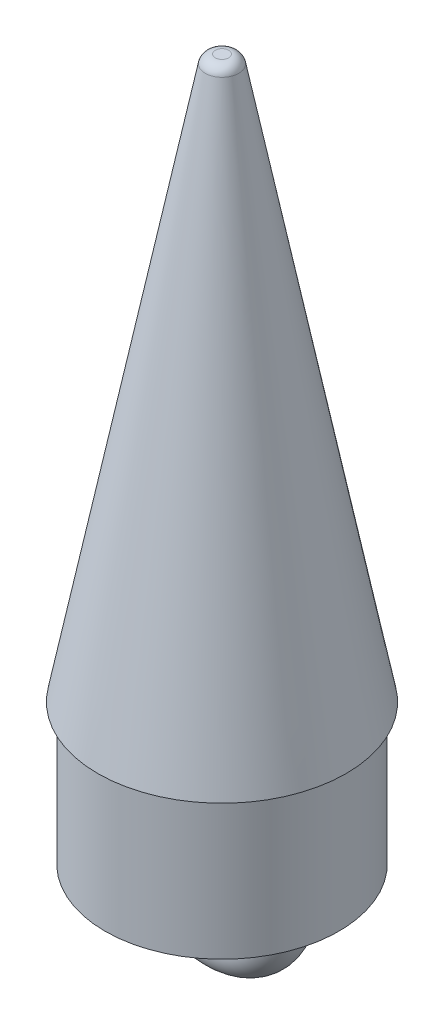
ISO-10303-21;
HEADER;
FILE_DESCRIPTION(('STEP AP214'),'2;1');
FILE_NAME('part.step','',(''),(''),'','','');
FILE_SCHEMA(('AUTOMOTIVE_DESIGN { 1 0 10303 214 1 1 1 1 }'));
ENDSEC;
DATA;
#1=APPLICATION_CONTEXT('core data for automotive mechanical design processes');
#2=APPLICATION_PROTOCOL_DEFINITION('international standard','automotive_design',2000,#1);
#3=PRODUCT_CONTEXT('',#1,'mechanical');
#4=PRODUCT('Part','Part','',(#3));
#5=PRODUCT_RELATED_PRODUCT_CATEGORY('part','',(#4));
#6=PRODUCT_DEFINITION_FORMATION('','',#4);
#7=PRODUCT_DEFINITION_CONTEXT('part definition',#1,'design');
#8=PRODUCT_DEFINITION('design','',#6,#7);
#9=PRODUCT_DEFINITION_SHAPE('','',#8);
#10=(LENGTH_UNIT() NAMED_UNIT(*) SI_UNIT(.MILLI.,.METRE.));
#11=(NAMED_UNIT(*) PLANE_ANGLE_UNIT() SI_UNIT($,.RADIAN.));
#12=(NAMED_UNIT(*) SI_UNIT($,.STERADIAN.) SOLID_ANGLE_UNIT());
#13=UNCERTAINTY_MEASURE_WITH_UNIT(LENGTH_MEASURE(1.E-05),#10,'distance_accuracy_value','');
#14=(GEOMETRIC_REPRESENTATION_CONTEXT(3) GLOBAL_UNCERTAINTY_ASSIGNED_CONTEXT((#13)) GLOBAL_UNIT_ASSIGNED_CONTEXT((#10,
#11,#12)) REPRESENTATION_CONTEXT('',''));
#15=CARTESIAN_POINT('',(0.,0.,0.));
#16=DIRECTION('',(0.,0.,1.));
#17=DIRECTION('',(1.,0.,0.));
#18=AXIS2_PLACEMENT_3D('',#15,#16,#17);
#19=CARTESIAN_POINT('',(0.,38.1,0.));
#20=DIRECTION('',(0.,-1.,0.));
#21=DIRECTION('',(0.,0.,-1.));
#22=AXIS2_PLACEMENT_3D('',#19,#20,#21);
#23=CYLINDRICAL_SURFACE('',#22,31.75);
#24=CARTESIAN_POINT('',(0.,0.,0.));
#25=DIRECTION('',(0.,1.,0.));
#26=DIRECTION('',(0.,0.,1.));
#27=AXIS2_PLACEMENT_3D('',#24,#25,#26);
#28=CIRCLE('',#27,31.75);
#29=CARTESIAN_POINT('',(0.,0.,-31.75));
#30=VERTEX_POINT('',#29);
#31=EDGE_CURVE('E88',#30,#30,#28,.T.);
#32=CARTESIAN_POINT('',(0.,38.1,0.));
#33=DIRECTION('',(0.,1.,0.));
#34=DIRECTION('',(0.,0.,1.));
#35=AXIS2_PLACEMENT_3D('',#32,#33,#34);
#36=CIRCLE('',#35,31.75);
#37=CARTESIAN_POINT('',(0.,38.1,-31.75));
#38=VERTEX_POINT('',#37);
#39=EDGE_CURVE('E87',#38,#38,#36,.T.);
#40=CARTESIAN_POINT('',(0.,0.,-31.75));
#41=CARTESIAN_POINT('',(0.,0.396875,-31.75));
#42=CARTESIAN_POINT('',(0.,0.79375,-31.75));
#43=CARTESIAN_POINT('',(0.,1.5875,-31.75));
#44=CARTESIAN_POINT('',(0.,1.984375,-31.75));
#45=CARTESIAN_POINT('',(0.,2.778125,-31.75));
#46=CARTESIAN_POINT('',(0.,3.175,-31.75));
#47=CARTESIAN_POINT('',(0.,3.96875,-31.75));
#48=CARTESIAN_POINT('',(0.,4.365625,-31.75));
#49=CARTESIAN_POINT('',(0.,5.159375,-31.75));
#50=CARTESIAN_POINT('',(0.,5.55625,-31.75));
#51=CARTESIAN_POINT('',(0.,6.35,-31.75));
#52=CARTESIAN_POINT('',(0.,6.746875,-31.75));
#53=CARTESIAN_POINT('',(0.,7.540625,-31.75));
#54=CARTESIAN_POINT('',(0.,7.93749999999999,-31.75));
#55=CARTESIAN_POINT('',(0.,8.73124999999999,-31.75));
#56=CARTESIAN_POINT('',(0.,9.128125,-31.75));
#57=CARTESIAN_POINT('',(0.,9.92187499999999,-31.75));
#58=CARTESIAN_POINT('',(0.,10.31875,-31.75));
#59=CARTESIAN_POINT('',(0.,11.1125,-31.75));
#60=CARTESIAN_POINT('',(0.,11.509375,-31.75));
#61=CARTESIAN_POINT('',(0.,12.303125,-31.75));
#62=CARTESIAN_POINT('',(0.,12.7,-31.75));
#63=CARTESIAN_POINT('',(0.,13.49375,-31.75));
#64=CARTESIAN_POINT('',(0.,13.890625,-31.75));
#65=CARTESIAN_POINT('',(0.,14.684375,-31.75));
#66=CARTESIAN_POINT('',(0.,15.08125,-31.75));
#67=CARTESIAN_POINT('',(0.,15.875,-31.75));
#68=CARTESIAN_POINT('',(0.,16.271875,-31.75));
#69=CARTESIAN_POINT('',(0.,17.065625,-31.75));
#70=CARTESIAN_POINT('',(0.,17.4625,-31.75));
#71=CARTESIAN_POINT('',(0.,18.25625,-31.75));
#72=CARTESIAN_POINT('',(0.,18.653125,-31.75));
#73=CARTESIAN_POINT('',(0.,19.446875,-31.75));
#74=CARTESIAN_POINT('',(0.,19.84375,-31.75));
#75=CARTESIAN_POINT('',(0.,20.6375,-31.75));
#76=CARTESIAN_POINT('',(0.,21.034375,-31.75));
#77=CARTESIAN_POINT('',(0.,21.828125,-31.75));
#78=CARTESIAN_POINT('',(0.,22.225,-31.75));
#79=CARTESIAN_POINT('',(0.,23.01875,-31.75));
#80=CARTESIAN_POINT('',(0.,23.415625,-31.75));
#81=CARTESIAN_POINT('',(0.,24.209375,-31.75));
#82=CARTESIAN_POINT('',(0.,24.60625,-31.75));
#83=CARTESIAN_POINT('',(0.,25.4,-31.75));
#84=CARTESIAN_POINT('',(0.,25.796875,-31.75));
#85=CARTESIAN_POINT('',(0.,26.590625,-31.75));
#86=CARTESIAN_POINT('',(0.,26.9875,-31.75));
#87=CARTESIAN_POINT('',(0.,27.78125,-31.75));
#88=CARTESIAN_POINT('',(0.,28.178125,-31.75));
#89=CARTESIAN_POINT('',(0.,28.971875,-31.75));
#90=CARTESIAN_POINT('',(0.,29.36875,-31.75));
#91=CARTESIAN_POINT('',(0.,30.1625,-31.75));
#92=CARTESIAN_POINT('',(0.,30.559375,-31.75));
#93=CARTESIAN_POINT('',(0.,31.353125,-31.75));
#94=CARTESIAN_POINT('',(0.,31.75,-31.75));
#95=CARTESIAN_POINT('',(0.,32.54375,-31.75));
#96=CARTESIAN_POINT('',(0.,32.940625,-31.75));
#97=CARTESIAN_POINT('',(0.,33.734375,-31.75));
#98=CARTESIAN_POINT('',(0.,34.13125,-31.75));
#99=CARTESIAN_POINT('',(0.,34.925,-31.75));
#100=CARTESIAN_POINT('',(0.,35.321875,-31.75));
#101=CARTESIAN_POINT('',(0.,36.115625,-31.75));
#102=CARTESIAN_POINT('',(0.,36.5125,-31.75));
#103=CARTESIAN_POINT('',(0.,37.30625,-31.75));
#104=CARTESIAN_POINT('',(0.,37.703125,-31.75));
#105=CARTESIAN_POINT('',(0.,38.1,-31.75));
#106=B_SPLINE_CURVE_WITH_KNOTS('',3,(#40,#41,#42,#43,#44,#45,#46,#47,#48,#49,#50,#51,#52,#53,
#54,#55,#56,#57,#58,#59,#60,#61,#62,#63,#64,#65,#66,#67,#68,#69,#70,#71,#72,#73,#74,#75,#76,#77,
#78,#79,#80,#81,#82,#83,#84,#85,#86,#87,#88,#89,#90,#91,#92,#93,#94,#95,#96,#97,#98,#99,#100,
#101,#102,#103,#104,#105),.UNSPECIFIED.,.F.,.F.,(4,2,2,2,2,2,2,2,2,2,2,2,2,2,2,2,2,2,2,2,2,2,2,
2,2,2,2,2,2,2,2,2,4),(0.,1.190625,2.38125,3.571875,4.7625,5.953125,7.14375,8.33437499999999,
9.525,10.715625,11.90625,13.096875,14.2875,15.478125,16.66875,17.859375,19.05,20.240625,
21.43125,22.621875,23.8125,25.003125,26.19375,27.384375,28.575,29.765625,30.95625,32.146875,
33.3375,34.528125,35.71875,36.909375,38.1),.UNSPECIFIED.);
#107=EDGE_CURVE('BSEAM46',#30,#38,#106,.T.);
#108=ORIENTED_EDGE('',*,*,#31,.T.);
#109=ORIENTED_EDGE('',*,*,#39,.F.);
#110=ORIENTED_EDGE('',*,*,#107,.T.);
#111=ORIENTED_EDGE('',*,*,#107,.F.);
#112=EDGE_LOOP('',(#108,#110,#109,#111));
#113=FACE_BOUND('',#112,.T.);
#114=ADVANCED_FACE('F46',(#113),#23,.T.);
#115=CARTESIAN_POINT('',(0.,0.,0.));
#116=DIRECTION('',(0.,1.,0.));
#117=DIRECTION('',(0.,0.,1.));
#118=AXIS2_PLACEMENT_3D('',#115,#116,#117);
#119=PLANE('',#118);
#120=CARTESIAN_POINT('',(17.0804375804376,0.,0.));
#121=DIRECTION('',(0.,1.,0.));
#122=DIRECTION('',(0.,0.,1.));
#123=AXIS2_PLACEMENT_3D('',#120,#121,#122);
#124=CIRCLE('',#123,6.35);
#125=CARTESIAN_POINT('',(23.4304375804376,0.,0.));
#126=VERTEX_POINT('',#125);
#127=EDGE_CURVE('E10',#126,#126,#124,.F.);
#128=ORIENTED_EDGE('',*,*,#127,.F.);
#129=EDGE_LOOP('',(#128));
#130=FACE_BOUND('',#129,.T.);
#131=CARTESIAN_POINT('',(-17.0804375804376,0.,0.));
#132=DIRECTION('',(0.,1.,0.));
#133=DIRECTION('',(0.,0.,1.));
#134=AXIS2_PLACEMENT_3D('',#131,#132,#133);
#135=CIRCLE('',#134,6.35);
#136=CARTESIAN_POINT('',(-23.4304375804376,0.,0.));
#137=VERTEX_POINT('',#136);
#138=EDGE_CURVE('E56',#137,#137,#135,.F.);
#139=ORIENTED_EDGE('',*,*,#138,.F.);
#140=EDGE_LOOP('',(#139));
#141=FACE_BOUND('',#140,.T.);
#142=ORIENTED_EDGE('',*,*,#31,.F.);
#143=EDGE_LOOP('',(#142));
#144=FACE_BOUND('',#143,.T.);
#145=ADVANCED_FACE('F153',(#130,#141,#144),#119,.F.);
#146=CARTESIAN_POINT('',(0.,38.1,0.));
#147=DIRECTION('',(0.,-1.,0.));
#148=DIRECTION('',(0.,0.,1.));
#149=AXIS2_PLACEMENT_3D('',#146,#147,#148);
#150=CONICAL_SURFACE('',#149,33.734375,0.191986217719376);
#151=CARTESIAN_POINT('',(0.,188.239120333082,0.));
#152=DIRECTION('',(0.,-1.,0.));
#153=DIRECTION('',(0.,0.,-1.));
#154=AXIS2_PLACEMENT_3D('',#151,#152,#153);
#155=CIRCLE('',#154,4.55028637599041);
#156=CARTESIAN_POINT('',(0.,188.239120333082,4.5502863759904));
#157=VERTEX_POINT('',#156);
#158=EDGE_CURVE('E69',#157,#157,#155,.T.);
#159=CARTESIAN_POINT('',(0.,38.1,0.));
#160=DIRECTION('',(0.,1.,0.));
#161=DIRECTION('',(0.,0.,1.));
#162=AXIS2_PLACEMENT_3D('',#159,#160,#161);
#163=CIRCLE('',#162,33.734375);
#164=CARTESIAN_POINT('',(0.,38.1,33.734375));
#165=VERTEX_POINT('',#164);
#166=EDGE_CURVE('E92',#165,#165,#163,.T.);
#167=CARTESIAN_POINT('',(0.,188.239120333082,4.5502863759904));
#168=CARTESIAN_POINT('',(0.,186.675171162946,4.85428729915717));
#169=CARTESIAN_POINT('',(0.,185.111221992809,5.15828822232393));
#170=CARTESIAN_POINT('',(0.,181.983323652537,5.76629006865746));
#171=CARTESIAN_POINT('',(0.,180.419374482401,6.07029099182423));
#172=CARTESIAN_POINT('',(0.,177.291476142128,6.67829283815777));
#173=CARTESIAN_POINT('',(0.,175.727526971992,6.98229376132454));
#174=CARTESIAN_POINT('',(0.,172.599628631719,7.59029560765807));
#175=CARTESIAN_POINT('',(0.,171.035679461583,7.89429653082484));
#176=CARTESIAN_POINT('',(0.,167.90778112131,8.50229837715837));
#177=CARTESIAN_POINT('',(0.,166.343831951174,8.80629930032513));
#178=CARTESIAN_POINT('',(0.,163.215933610902,9.41430114665867));
#179=CARTESIAN_POINT('',(0.,161.651984440765,9.71830206982544));
#180=CARTESIAN_POINT('',(0.,158.524086100493,10.326303916159));
#181=CARTESIAN_POINT('',(0.,156.960136930357,10.6303048393257));
#182=CARTESIAN_POINT('',(0.,153.832238590084,11.2383066856593));
#183=CARTESIAN_POINT('',(0.,152.268289419948,11.542307608826));
#184=CARTESIAN_POINT('',(0.,149.140391079675,12.1503094551596));
#185=CARTESIAN_POINT('',(0.,147.576441909539,12.4543103783263));
#186=CARTESIAN_POINT('',(0.,144.448543569266,13.0623122246599));
#187=CARTESIAN_POINT('',(0.,142.88459439913,13.3663131478266));
#188=CARTESIAN_POINT('',(0.,139.756696058858,13.9743149941602));
#189=CARTESIAN_POINT('',(0.,138.192746888721,14.2783159173269));
#190=CARTESIAN_POINT('',(0.,135.064848548449,14.8863177636605));
#191=CARTESIAN_POINT('',(0.,133.500899378313,15.1903186868272));
#192=CARTESIAN_POINT('',(0.,130.37300103804,15.7983205331608));
#193=CARTESIAN_POINT('',(0.,128.809051867904,16.1023214563275));
#194=CARTESIAN_POINT('',(0.,125.681153527631,16.7103233026611));
#195=CARTESIAN_POINT('',(0.,124.117204357495,17.0143242258278));
#196=CARTESIAN_POINT('',(0.,120.989306017222,17.6223260721614));
#197=CARTESIAN_POINT('',(0.,119.425356847086,17.9263269953281));
#198=CARTESIAN_POINT('',(0.,116.297458506814,18.5343288416617));
#199=CARTESIAN_POINT('',(0.,114.733509336677,18.8383297648284));
#200=CARTESIAN_POINT('',(0.,111.605610996405,19.446331611162));
#201=CARTESIAN_POINT('',(0.,110.041661826268,19.7503325343287));
#202=CARTESIAN_POINT('',(0.,106.913763485996,20.3583343806623));
#203=CARTESIAN_POINT('',(0.,105.34981431586,20.662335303829));
#204=CARTESIAN_POINT('',(0.,102.221915975587,21.2703371501626));
#205=CARTESIAN_POINT('',(0.,100.657966805451,21.5743380733293));
#206=CARTESIAN_POINT('',(0.,97.5300684651783,22.1823399196629));
#207=CARTESIAN_POINT('',(0.,95.966119295042,22.4863408428296));
#208=CARTESIAN_POINT('',(0.,92.8382209547695,23.0943426891632));
#209=CARTESIAN_POINT('',(0.,91.2742717846332,23.3983436123299));
#210=CARTESIAN_POINT('',(0.,88.1463734443607,24.0063454586635));
#211=CARTESIAN_POINT('',(0.,86.5824242742244,24.3103463818302));
#212=CARTESIAN_POINT('',(0.,83.4545259339518,24.9183482281638));
#213=CARTESIAN_POINT('',(0.,81.8905767638156,25.2223491513305));
#214=CARTESIAN_POINT('',(0.,78.762678423543,25.8303509976641));
#215=CARTESIAN_POINT('',(0.,77.1987292534068,26.1343519208308));
#216=CARTESIAN_POINT('',(0.,74.0708309131342,26.7423537671644));
#217=CARTESIAN_POINT('',(0.,72.5068817429979,27.0463546903311));
#218=CARTESIAN_POINT('',(0.,69.3789834027254,27.6543565366647));
#219=CARTESIAN_POINT('',(0.,67.8150342325891,27.9583574598314));
#220=CARTESIAN_POINT('',(0.,64.6871358923166,28.566359306165));
#221=CARTESIAN_POINT('',(0.,63.1231867221803,28.8703602293317));
#222=CARTESIAN_POINT('',(0.,59.9952883819078,29.4783620756653));
#223=CARTESIAN_POINT('',(0.,58.4313392117715,29.782362998832));
#224=CARTESIAN_POINT('',(0.,55.303440871499,30.3903648451656));
#225=CARTESIAN_POINT('',(0.,53.7394917013627,30.6943657683323));
#226=CARTESIAN_POINT('',(0.,50.6115933610902,31.3023676146659));
#227=CARTESIAN_POINT('',(0.,49.0476441909539,31.6063685378326));
#228=CARTESIAN_POINT('',(0.,45.9197458506814,32.2143703841662));
#229=CARTESIAN_POINT('',(0.,44.3557966805451,32.5183713073329));
#230=CARTESIAN_POINT('',(0.,41.2278983402725,33.1263731536665));
#231=CARTESIAN_POINT('',(0.,39.6639491701363,33.4303740768332));
#232=CARTESIAN_POINT('',(0.,38.1,33.734375));
#233=B_SPLINE_CURVE_WITH_KNOTS('',3,(#167,#168,#169,#170,#171,#172,#173,#174,#175,#176,#177,
#178,#179,#180,#181,#182,#183,#184,#185,#186,#187,#188,#189,#190,#191,#192,#193,#194,#195,#196,
#197,#198,#199,#200,#201,#202,#203,#204,#205,#206,#207,#208,#209,#210,#211,#212,#213,#214,#215,
#216,#217,#218,#219,#220,#221,#222,#223,#224,#225,#226,#227,#228,#229,#230,#231,#232),
.UNSPECIFIED.,.F.,.F.,(4,2,2,2,2,2,2,2,2,2,2,2,2,2,2,2,2,2,2,2,2,2,2,2,2,2,2,2,2,2,2,2,4),(0.,
4.7796633890375,9.55932677807503,14.3389901671126,19.1186535561501,23.8983169451876,
28.6779803342251,33.4576437232626,38.2373071123001,43.0169705013376,47.7966338903751,
52.5762972794126,57.3559606684502,62.1356240574877,66.9152874465252,71.6949508355627,
76.4746142246002,81.2542776136377,86.0339410026752,90.8136043917128,95.5932677807503,
100.372931169788,105.152594558825,109.932257947863,114.7119213369,119.491584725938,
124.271248114975,129.050911504013,133.83057489305,138.610238282088,143.389901671125,
148.169565060163,152.9492284492),.UNSPECIFIED.);
#234=EDGE_CURVE('BSEAM157',#157,#165,#233,.T.);
#235=ORIENTED_EDGE('',*,*,#158,.T.);
#236=ORIENTED_EDGE('',*,*,#166,.T.);
#237=ORIENTED_EDGE('',*,*,#234,.T.);
#238=ORIENTED_EDGE('',*,*,#234,.F.);
#239=EDGE_LOOP('',(#235,#237,#236,#238));
#240=FACE_BOUND('',#239,.T.);
#241=ADVANCED_FACE('F157',(#240),#150,.T.);
#242=CARTESIAN_POINT('',(0.,190.5,0.));
#243=DIRECTION('',(0.,1.,0.));
#244=DIRECTION('',(0.,0.,1.));
#245=AXIS2_PLACEMENT_3D('',#242,#243,#244);
#246=PLANE('',#245);
#247=CARTESIAN_POINT('',(0.,190.5,0.));
#248=DIRECTION('',(0.,1.,0.));
#249=DIRECTION('',(0.,0.,1.));
#250=AXIS2_PLACEMENT_3D('',#247,#248,#249);
#251=CIRCLE('',#250,1.80762002543764);
#252=CARTESIAN_POINT('',(0.,190.5,1.80762002543764));
#253=VERTEX_POINT('',#252);
#254=EDGE_CURVE('E83',#253,#253,#251,.T.);
#255=ORIENTED_EDGE('',*,*,#254,.T.);
#256=EDGE_LOOP('',(#255));
#257=FACE_BOUND('',#256,.T.);
#258=ADVANCED_FACE('F182',(#257),#246,.T.);
#259=CARTESIAN_POINT('',(0.,38.1,0.));
#260=DIRECTION('',(0.,1.,0.));
#261=DIRECTION('',(0.,0.,1.));
#262=AXIS2_PLACEMENT_3D('',#259,#260,#261);
#263=PLANE('',#262);
#264=ORIENTED_EDGE('',*,*,#39,.T.);
#265=EDGE_LOOP('',(#264));
#266=FACE_BOUND('',#265,.T.);
#267=ORIENTED_EDGE('',*,*,#166,.F.);
#268=EDGE_LOOP('',(#267));
#269=FACE_BOUND('',#268,.T.);
#270=ADVANCED_FACE('F191',(#266,#269),#263,.F.);
#271=CARTESIAN_POINT('',(0.,187.706,0.));
#272=DIRECTION('',(0.,1.,0.));
#273=DIRECTION('',(0.,0.,1.));
#274=AXIS2_PLACEMENT_3D('',#271,#272,#273);
#275=DEGENERATE_TOROIDAL_SURFACE('',#274,1.80762002543764,2.794,.T.);
#276=ORIENTED_EDGE('',*,*,#158,.F.);
#277=EDGE_LOOP('',(#276));
#278=FACE_BOUND('',#277,.T.);
#279=ORIENTED_EDGE('',*,*,#254,.F.);
#280=EDGE_LOOP('',(#279));
#281=FACE_BOUND('',#280,.T.);
#282=ADVANCED_FACE('F128',(#278,#281),#275,.T.);
#283=CARTESIAN_POINT('',(0.,0.,0.));
#284=DIRECTION('',(0.,0.,-1.));
#285=DIRECTION('',(-1.,0.,0.));
#286=AXIS2_PLACEMENT_3D('',#283,#284,#285);
#287=TOROIDAL_SURFACE('',#286,17.0804375804376,6.35);
#288=CARTESIAN_POINT('',(0.,0.,0.));
#289=DIRECTION('',(0.,0.,-1.));
#290=DIRECTION('',(-1.,0.,0.));
#291=AXIS2_PLACEMENT_3D('',#288,#289,#290);
#292=CIRCLE('',#291,23.4304375804376);
#293=EDGE_CURVE('',#126,#137,#292,.T.);
#294=ORIENTED_EDGE('',*,*,#127,.T.);
#295=ORIENTED_EDGE('',*,*,#138,.T.);
#296=ORIENTED_EDGE('',*,*,#293,.T.);
#297=ORIENTED_EDGE('',*,*,#293,.F.);
#298=EDGE_LOOP('',(#294,#296,#295,#297));
#299=FACE_BOUND('',#298,.T.);
#300=ADVANCED_FACE('F165',(#299),#287,.T.);
#301=CLOSED_SHELL('',(#114,#145,#241,#258,#270,#282,#300));
#302=CARTESIAN_POINT('',(0.,38.1,0.));
#303=DIRECTION('',(0.,-1.,0.));
#304=DIRECTION('',(0.,0.,-1.));
#305=AXIS2_PLACEMENT_3D('',#302,#303,#304);
#306=CYLINDRICAL_SURFACE('',#305,30.48);
#307=CARTESIAN_POINT('',(0.,39.37,0.));
#308=DIRECTION('',(0.,1.,0.));
#309=DIRECTION('',(0.,0.,1.));
#310=AXIS2_PLACEMENT_3D('',#307,#308,#309);
#311=CIRCLE('',#310,30.48);
#312=CARTESIAN_POINT('',(0.,39.37,-30.48));
#313=VERTEX_POINT('',#312);
#314=EDGE_CURVE('E61',#313,#313,#311,.T.);
#315=CARTESIAN_POINT('',(0.,6.35,0.));
#316=DIRECTION('',(0.,-1.,0.));
#317=DIRECTION('',(0.,0.,-1.));
#318=AXIS2_PLACEMENT_3D('',#315,#316,#317);
#319=CIRCLE('',#318,30.48);
#320=CARTESIAN_POINT('',(0.,6.35000000000001,-30.48));
#321=VERTEX_POINT('',#320);
#322=EDGE_CURVE('E50',#321,#321,#319,.T.);
#323=CARTESIAN_POINT('',(0.,39.37,-30.48));
#324=CARTESIAN_POINT('',(0.,39.0260416666667,-30.48));
#325=CARTESIAN_POINT('',(0.,38.6820833333333,-30.48));
#326=CARTESIAN_POINT('',(0.,37.9941666666667,-30.48));
#327=CARTESIAN_POINT('',(0.,37.6502083333333,-30.48));
#328=CARTESIAN_POINT('',(0.,36.9622916666667,-30.48));
#329=CARTESIAN_POINT('',(0.,36.6183333333333,-30.48));
#330=CARTESIAN_POINT('',(0.,35.9304166666667,-30.48));
#331=CARTESIAN_POINT('',(0.,35.5864583333333,-30.48));
#332=CARTESIAN_POINT('',(0.,34.8985416666667,-30.48));
#333=CARTESIAN_POINT('',(0.,34.5545833333333,-30.48));
#334=CARTESIAN_POINT('',(0.,33.8666666666667,-30.48));
#335=CARTESIAN_POINT('',(0.,33.5227083333333,-30.48));
#336=CARTESIAN_POINT('',(0.,32.8347916666667,-30.48));
#337=CARTESIAN_POINT('',(0.,32.4908333333333,-30.48));
#338=CARTESIAN_POINT('',(0.,31.8029166666667,-30.48));
#339=CARTESIAN_POINT('',(0.,31.4589583333333,-30.48));
#340=CARTESIAN_POINT('',(0.,30.7710416666667,-30.48));
#341=CARTESIAN_POINT('',(0.,30.4270833333333,-30.48));
#342=CARTESIAN_POINT('',(0.,29.7391666666667,-30.48));
#343=CARTESIAN_POINT('',(0.,29.3952083333333,-30.48));
#344=CARTESIAN_POINT('',(0.,28.7072916666667,-30.48));
#345=CARTESIAN_POINT('',(0.,28.3633333333333,-30.48));
#346=CARTESIAN_POINT('',(0.,27.6754166666667,-30.48));
#347=CARTESIAN_POINT('',(0.,27.3314583333333,-30.48));
#348=CARTESIAN_POINT('',(0.,26.6435416666667,-30.48));
#349=CARTESIAN_POINT('',(0.,26.2995833333333,-30.48));
#350=CARTESIAN_POINT('',(0.,25.6116666666667,-30.48));
#351=CARTESIAN_POINT('',(0.,25.2677083333333,-30.48));
#352=CARTESIAN_POINT('',(0.,24.5797916666667,-30.48));
#353=CARTESIAN_POINT('',(0.,24.2358333333333,-30.48));
#354=CARTESIAN_POINT('',(0.,23.5479166666667,-30.48));
#355=CARTESIAN_POINT('',(0.,23.2039583333333,-30.48));
#356=CARTESIAN_POINT('',(0.,22.5160416666667,-30.48));
#357=CARTESIAN_POINT('',(0.,22.1720833333333,-30.48));
#358=CARTESIAN_POINT('',(0.,21.4841666666667,-30.48));
#359=CARTESIAN_POINT('',(0.,21.1402083333333,-30.48));
#360=CARTESIAN_POINT('',(0.,20.4522916666667,-30.48));
#361=CARTESIAN_POINT('',(0.,20.1083333333333,-30.48));
#362=CARTESIAN_POINT('',(0.,19.4204166666667,-30.48));
#363=CARTESIAN_POINT('',(0.,19.0764583333333,-30.48));
#364=CARTESIAN_POINT('',(0.,18.3885416666667,-30.48));
#365=CARTESIAN_POINT('',(0.,18.0445833333333,-30.48));
#366=CARTESIAN_POINT('',(0.,17.3566666666667,-30.48));
#367=CARTESIAN_POINT('',(0.,17.0127083333333,-30.48));
#368=CARTESIAN_POINT('',(0.,16.3247916666667,-30.48));
#369=CARTESIAN_POINT('',(0.,15.9808333333333,-30.48));
#370=CARTESIAN_POINT('',(0.,15.2929166666667,-30.48));
#371=CARTESIAN_POINT('',(0.,14.9489583333333,-30.48));
#372=CARTESIAN_POINT('',(0.,14.2610416666667,-30.48));
#373=CARTESIAN_POINT('',(0.,13.9170833333333,-30.48));
#374=CARTESIAN_POINT('',(0.,13.2291666666667,-30.48));
#375=CARTESIAN_POINT('',(0.,12.8852083333333,-30.48));
#376=CARTESIAN_POINT('',(0.,12.1972916666667,-30.48));
#377=CARTESIAN_POINT('',(0.,11.8533333333333,-30.48));
#378=CARTESIAN_POINT('',(0.,11.1654166666667,-30.48));
#379=CARTESIAN_POINT('',(0.,10.8214583333333,-30.48));
#380=CARTESIAN_POINT('',(0.,10.1335416666667,-30.48));
#381=CARTESIAN_POINT('',(0.,9.78958333333334,-30.48));
#382=CARTESIAN_POINT('',(0.,9.10166666666667,-30.48));
#383=CARTESIAN_POINT('',(0.,8.75770833333334,-30.48));
#384=CARTESIAN_POINT('',(0.,8.06979166666667,-30.48));
#385=CARTESIAN_POINT('',(0.,7.72583333333334,-30.48));
#386=CARTESIAN_POINT('',(0.,7.03791666666668,-30.48));
#387=CARTESIAN_POINT('',(0.,6.69395833333334,-30.48));
#388=CARTESIAN_POINT('',(0.,6.35000000000001,-30.48));
#389=B_SPLINE_CURVE_WITH_KNOTS('',3,(#323,#324,#325,#326,#327,#328,#329,#330,#331,#332,#333,
#334,#335,#336,#337,#338,#339,#340,#341,#342,#343,#344,#345,#346,#347,#348,#349,#350,#351,#352,
#353,#354,#355,#356,#357,#358,#359,#360,#361,#362,#363,#364,#365,#366,#367,#368,#369,#370,#371,
#372,#373,#374,#375,#376,#377,#378,#379,#380,#381,#382,#383,#384,#385,#386,#387,#388),
.UNSPECIFIED.,.F.,.F.,(4,2,2,2,2,2,2,2,2,2,2,2,2,2,2,2,2,2,2,2,2,2,2,2,2,2,2,2,2,2,2,2,4),(0.,
1.03187499999999,2.06375,3.095625,4.12749999999999,5.15937499999999,6.19125,7.223125,8.255,
9.28687499999999,10.31875,11.350625,12.3825,13.414375,14.44625,15.478125,16.51,17.541875,
18.57375,19.605625,20.6375,21.669375,22.70125,23.733125,24.765,25.796875,26.82875,27.860625,
28.8925,29.924375,30.95625,31.988125,33.02),.UNSPECIFIED.);
#390=EDGE_CURVE('BSEAM104',#313,#321,#389,.T.);
#391=ORIENTED_EDGE('',*,*,#314,.T.);
#392=ORIENTED_EDGE('',*,*,#322,.T.);
#393=ORIENTED_EDGE('',*,*,#390,.T.);
#394=ORIENTED_EDGE('',*,*,#390,.F.);
#395=EDGE_LOOP('',(#391,#393,#392,#394));
#396=FACE_BOUND('',#395,.T.);
#397=ADVANCED_FACE('F104',(#396),#306,.F.);
#398=CARTESIAN_POINT('',(0.,37.8576725758718,0.));
#399=DIRECTION('',(0.,-1.,0.));
#400=DIRECTION('',(0.,0.,1.));
#401=AXIS2_PLACEMENT_3D('',#398,#399,#400);
#402=CONICAL_SURFACE('',#401,32.4877084770215,0.191986217719376);
#403=CARTESIAN_POINT('',(0.,187.996792908954,0.));
#404=DIRECTION('',(0.,-1.,0.));
#405=DIRECTION('',(0.,0.,-1.));
#406=AXIS2_PLACEMENT_3D('',#403,#404,#405);
#407=CIRCLE('',#406,3.30361985301187);
#408=CARTESIAN_POINT('',(0.,187.996792908954,3.30361985301187));
#409=VERTEX_POINT('',#408);
#410=EDGE_CURVE('E64',#409,#409,#407,.T.);
#411=CARTESIAN_POINT('',(0.,39.37,0.));
#412=DIRECTION('',(0.,1.,0.));
#413=DIRECTION('',(0.,0.,1.));
#414=AXIS2_PLACEMENT_3D('',#411,#412,#413);
#415=CIRCLE('',#414,32.193741804802);
#416=CARTESIAN_POINT('',(0.,39.37,32.193741804802));
#417=VERTEX_POINT('',#416);
#418=EDGE_CURVE('E68',#417,#417,#415,.T.);
#419=CARTESIAN_POINT('',(0.,187.996792908954,3.30361985301187));
#420=CARTESIAN_POINT('',(0.,186.448597149485,3.60455862334301));
#421=CARTESIAN_POINT('',(0.,184.900401390017,3.90549739367416));
#422=CARTESIAN_POINT('',(0.,181.804009871081,4.50737493433645));
#423=CARTESIAN_POINT('',(0.,180.255814111612,4.8083137046676));
#424=CARTESIAN_POINT('',(0.,177.159422592676,5.41019124532989));
#425=CARTESIAN_POINT('',(0.,175.611226833208,5.71113001566104));
#426=CARTESIAN_POINT('',(0.,172.514835314271,6.31300755632333));
#427=CARTESIAN_POINT('',(0.,170.966639554803,6.61394632665448));
#428=CARTESIAN_POINT('',(0.,167.870248035866,7.21582386731678));
#429=CARTESIAN_POINT('',(0.,166.322052276398,7.51676263764792));
#430=CARTESIAN_POINT('',(0.,163.225660757461,8.11864017831022));
#431=CARTESIAN_POINT('',(0.,161.677464997993,8.41957894864137));
#432=CARTESIAN_POINT('',(0.,158.581073479057,9.02145648930366));
#433=CARTESIAN_POINT('',(0.,157.032877719588,9.3223952596348));
#434=CARTESIAN_POINT('',(0.,153.936486200652,9.9242728002971));
#435=CARTESIAN_POINT('',(0.,152.388290441184,10.2252115706282));
#436=CARTESIAN_POINT('',(0.,149.291898922247,10.8270891112905));
#437=CARTESIAN_POINT('',(0.,147.743703162779,11.1280278816217));
#438=CARTESIAN_POINT('',(0.,144.647311643842,11.729905422284));
#439=CARTESIAN_POINT('',(0.,143.099115884374,12.0308441926151));
#440=CARTESIAN_POINT('',(0.,140.002724365437,12.6327217332774));
#441=CARTESIAN_POINT('',(0.,138.454528605969,12.9336605036086));
#442=CARTESIAN_POINT('',(0.,135.358137087033,13.5355380442709));
#443=CARTESIAN_POINT('',(0.,133.809941327564,13.836476814602));
#444=CARTESIAN_POINT('',(0.,130.713549808628,14.4383543552643));
#445=CARTESIAN_POINT('',(0.,129.16535404916,14.7392931255954));
#446=CARTESIAN_POINT('',(0.,126.068962530223,15.3411706662577));
#447=CARTESIAN_POINT('',(0.,124.520766770755,15.6421094365889));
#448=CARTESIAN_POINT('',(0.,121.424375251818,16.2439869772512));
#449=CARTESIAN_POINT('',(0.,119.87617949235,16.5449257475823));
#450=CARTESIAN_POINT('',(0.,116.779787973413,17.1468032882446));
#451=CARTESIAN_POINT('',(0.,115.231592213945,17.4477420585758));
#452=CARTESIAN_POINT('',(0.,112.135200695009,18.0496195992381));
#453=CARTESIAN_POINT('',(0.,110.58700493554,18.3505583695692));
#454=CARTESIAN_POINT('',(0.,107.490613416604,18.9524359102315));
#455=CARTESIAN_POINT('',(0.,105.942417657136,19.2533746805627));
#456=CARTESIAN_POINT('',(0.,102.846026138199,19.8552522212249));
#457=CARTESIAN_POINT('',(0.,101.297830378731,20.1561909915561));
#458=CARTESIAN_POINT('',(0.,98.2014388597942,20.7580685322184));
#459=CARTESIAN_POINT('',(0.,96.6532431003259,21.0590073025495));
#460=CARTESIAN_POINT('',(0.,93.5568515813894,21.6608848432118));
#461=CARTESIAN_POINT('',(0.,92.0086558219211,21.961823613543));
#462=CARTESIAN_POINT('',(0.,88.9122643029846,22.5637011542053));
#463=CARTESIAN_POINT('',(0.,87.3640685435163,22.8646399245364));
#464=CARTESIAN_POINT('',(0.,84.2676770245798,23.4665174651987));
#465=CARTESIAN_POINT('',(0.,82.7194812651115,23.7674562355299));
#466=CARTESIAN_POINT('',(0.,79.623089746175,24.3693337761922));
#467=CARTESIAN_POINT('',(0.,78.0748939867067,24.6702725465233));
#468=CARTESIAN_POINT('',(0.,74.9785024677702,25.2721500871856));
#469=CARTESIAN_POINT('',(0.,73.4303067083019,25.5730888575167));
#470=CARTESIAN_POINT('',(0.,70.3339151893654,26.174966398179));
#471=CARTESIAN_POINT('',(0.,68.7857194298971,26.4759051685102));
#472=CARTESIAN_POINT('',(0.,65.6893279109606,27.0777827091725));
#473=CARTESIAN_POINT('',(0.,64.1411321514923,27.3787214795036));
#474=CARTESIAN_POINT('',(0.,61.0447406325558,27.9805990201659));
#475=CARTESIAN_POINT('',(0.,59.4965448730875,28.2815377904971));
#476=CARTESIAN_POINT('',(0.,56.400153354151,28.8834153311594));
#477=CARTESIAN_POINT('',(0.,54.8519575946827,29.1843541014905));
#478=CARTESIAN_POINT('',(0.,51.7555660757461,29.7862316421528));
#479=CARTESIAN_POINT('',(0.,50.2073703162779,30.0871704124839));
#480=CARTESIAN_POINT('',(0.,47.1109787973413,30.6890479531462));
#481=CARTESIAN_POINT('',(0.,45.5627830378731,30.9899867234774));
#482=CARTESIAN_POINT('',(0.,42.4663915189365,31.5918642641397));
#483=CARTESIAN_POINT('',(0.,40.9181957594683,31.8928030344708));
#484=CARTESIAN_POINT('',(0.,39.37,32.193741804802));
#485=B_SPLINE_CURVE_WITH_KNOTS('',3,(#419,#420,#421,#422,#423,#424,#425,#426,#427,#428,#429,
#430,#431,#432,#433,#434,#435,#436,#437,#438,#439,#440,#441,#442,#443,#444,#445,#446,#447,#448,
#449,#450,#451,#452,#453,#454,#455,#456,#457,#458,#459,#460,#461,#462,#463,#464,#465,#466,#467,
#468,#469,#470,#471,#472,#473,#474,#475,#476,#477,#478,#479,#480,#481,#482,#483,#484),
.UNSPECIFIED.,.F.,.F.,(4,2,2,2,2,2,2,2,2,2,2,2,2,2,2,2,2,2,2,2,2,2,2,2,2,2,2,2,2,2,2,2,4),(0.,
4.7315186016876,9.46303720337515,14.1945558050628,18.9260744067503,23.6575930084379,
28.3891116101255,33.1206302118131,37.8521488135006,42.5836674151882,47.3151860168758,
52.0467046185634,56.7782232202509,61.5097418219385,66.2412604236261,70.9727790253137,
75.7042976270013,80.4358162286888,85.1673348303764,89.898853432064,94.6303720337516,
99.3618906354391,104.093409237127,108.824927838814,113.556446440502,118.287965042189,
123.019483643877,127.751002245565,132.482520847252,137.21403944894,141.945558050627,
146.677076652315,151.408595254003),.UNSPECIFIED.);
#486=EDGE_CURVE('BSEAM117',#409,#417,#485,.T.);
#487=ORIENTED_EDGE('',*,*,#410,.F.);
#488=ORIENTED_EDGE('',*,*,#418,.F.);
#489=ORIENTED_EDGE('',*,*,#486,.T.);
#490=ORIENTED_EDGE('',*,*,#486,.F.);
#491=EDGE_LOOP('',(#487,#489,#488,#490));
#492=FACE_BOUND('',#491,.T.);
#493=ADVANCED_FACE('F117',(#492),#402,.F.);
#494=CARTESIAN_POINT('',(0.,189.23,0.));
#495=DIRECTION('',(0.,1.,0.));
#496=DIRECTION('',(0.,0.,1.));
#497=AXIS2_PLACEMENT_3D('',#494,#495,#496);
#498=PLANE('',#497);
#499=CARTESIAN_POINT('',(0.,189.23,0.));
#500=DIRECTION('',(0.,1.,0.));
#501=DIRECTION('',(0.,0.,1.));
#502=AXIS2_PLACEMENT_3D('',#499,#500,#501);
#503=CIRCLE('',#502,1.80762002543764);
#504=CARTESIAN_POINT('',(0.,189.23,1.80762002543764));
#505=VERTEX_POINT('',#504);
#506=EDGE_CURVE('E73',#505,#505,#503,.T.);
#507=ORIENTED_EDGE('',*,*,#506,.F.);
#508=EDGE_LOOP('',(#507));
#509=FACE_BOUND('',#508,.T.);
#510=ADVANCED_FACE('F124',(#509),#498,.F.);
#511=CARTESIAN_POINT('',(0.,39.37,0.));
#512=DIRECTION('',(0.,1.,0.));
#513=DIRECTION('',(0.,0.,1.));
#514=AXIS2_PLACEMENT_3D('',#511,#512,#513);
#515=PLANE('',#514);
#516=ORIENTED_EDGE('',*,*,#314,.F.);
#517=EDGE_LOOP('',(#516));
#518=FACE_BOUND('',#517,.T.);
#519=ORIENTED_EDGE('',*,*,#418,.T.);
#520=EDGE_LOOP('',(#519));
#521=FACE_BOUND('',#520,.T.);
#522=ADVANCED_FACE('F114',(#518,#521),#515,.T.);
#523=CARTESIAN_POINT('',(0.,187.706,0.));
#524=DIRECTION('',(0.,1.,0.));
#525=DIRECTION('',(0.,0.,1.));
#526=AXIS2_PLACEMENT_3D('',#523,#524,#525);
#527=TOROIDAL_SURFACE('',#526,1.80762002543764,1.524);
#528=ORIENTED_EDGE('',*,*,#410,.T.);
#529=EDGE_LOOP('',(#528));
#530=FACE_BOUND('',#529,.T.);
#531=ORIENTED_EDGE('',*,*,#506,.T.);
#532=EDGE_LOOP('',(#531));
#533=FACE_BOUND('',#532,.T.);
#534=ADVANCED_FACE('F48',(#530,#533),#527,.F.);
#535=CARTESIAN_POINT('',(0.,6.35,0.));
#536=DIRECTION('',(0.,-1.,0.));
#537=DIRECTION('',(0.,0.,-1.));
#538=AXIS2_PLACEMENT_3D('',#535,#536,#537);
#539=PLANE('',#538);
#540=ORIENTED_EDGE('',*,*,#322,.F.);
#541=EDGE_LOOP('',(#540));
#542=FACE_BOUND('',#541,.T.);
#543=ADVANCED_FACE('F106',(#542),#539,.F.);
#544=CLOSED_SHELL('',(#397,#493,#510,#522,#534,#543));
#545=ORIENTED_CLOSED_SHELL('',*,#544,.T.);
#546=BREP_WITH_VOIDS('B2',#301,(#545));
#547=ADVANCED_BREP_SHAPE_REPRESENTATION('',(#18,#546),#14);
#548=SHAPE_DEFINITION_REPRESENTATION(#9,#547);
ENDSEC;
END-ISO-10303-21;
